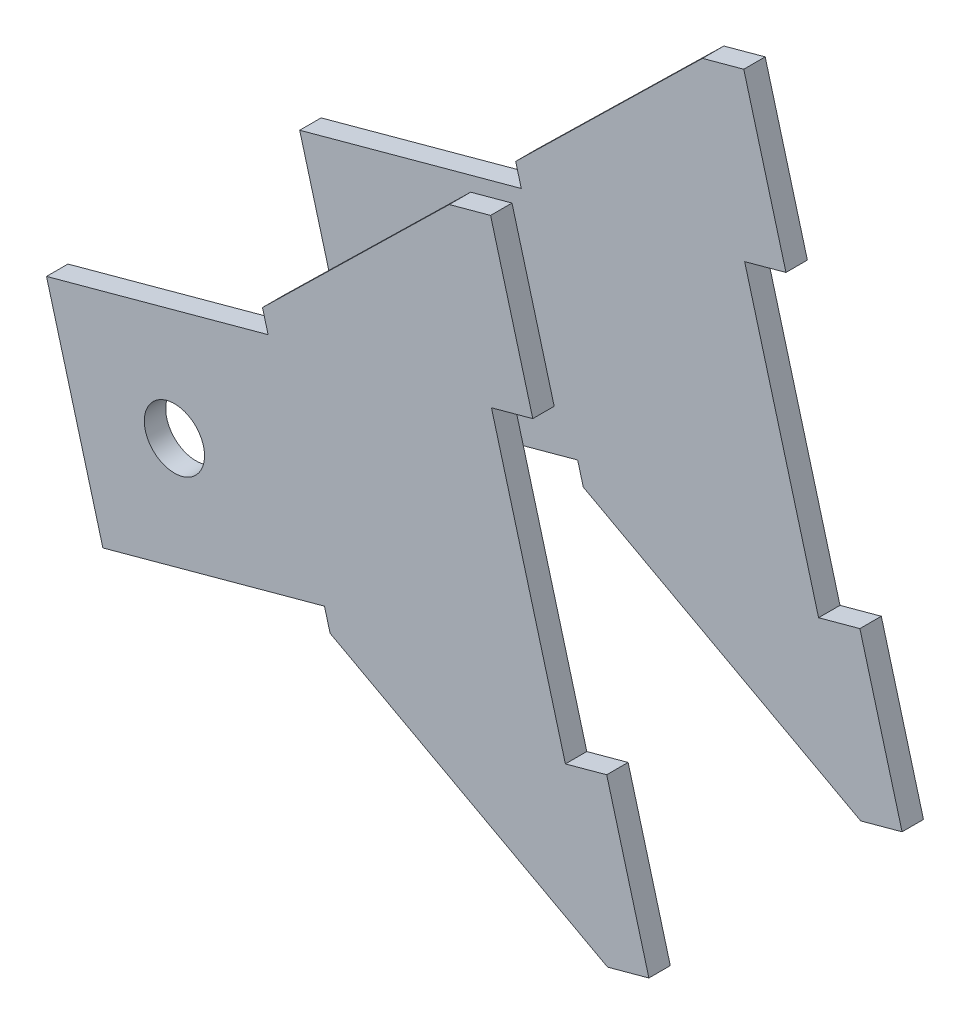
ISO-10303-21;
HEADER;
FILE_DESCRIPTION(('STEP AP214'),'2;1');
FILE_NAME('part.step','',(''),(''),'','','');
FILE_SCHEMA(('AUTOMOTIVE_DESIGN { 1 0 10303 214 1 1 1 1 }'));
ENDSEC;
DATA;
#1=APPLICATION_CONTEXT('core data for automotive mechanical design processes');
#2=APPLICATION_PROTOCOL_DEFINITION('international standard','automotive_design',2000,#1);
#3=PRODUCT_CONTEXT('',#1,'mechanical');
#4=PRODUCT('Part','Part','',(#3));
#5=PRODUCT_RELATED_PRODUCT_CATEGORY('part','',(#4));
#6=PRODUCT_DEFINITION_FORMATION('','',#4);
#7=PRODUCT_DEFINITION_CONTEXT('part definition',#1,'design');
#8=PRODUCT_DEFINITION('design','',#6,#7);
#9=PRODUCT_DEFINITION_SHAPE('','',#8);
#10=(LENGTH_UNIT() NAMED_UNIT(*) SI_UNIT(.MILLI.,.METRE.));
#11=(NAMED_UNIT(*) PLANE_ANGLE_UNIT() SI_UNIT($,.RADIAN.));
#12=(NAMED_UNIT(*) SI_UNIT($,.STERADIAN.) SOLID_ANGLE_UNIT());
#13=UNCERTAINTY_MEASURE_WITH_UNIT(LENGTH_MEASURE(1.E-05),#10,'distance_accuracy_value','');
#14=(GEOMETRIC_REPRESENTATION_CONTEXT(3) GLOBAL_UNCERTAINTY_ASSIGNED_CONTEXT((#13)) GLOBAL_UNIT_ASSIGNED_CONTEXT((#10,
#11,#12)) REPRESENTATION_CONTEXT('',''));
#15=CARTESIAN_POINT('',(0.,0.,0.));
#16=DIRECTION('',(0.,0.,1.));
#17=DIRECTION('',(1.,0.,0.));
#18=AXIS2_PLACEMENT_3D('',#15,#16,#17);
#19=CARTESIAN_POINT('',(0.,0.,-204.004012900365));
#20=DIRECTION('',(0.,0.,-1.));
#21=DIRECTION('',(-1.,0.,0.));
#22=AXIS2_PLACEMENT_3D('',#19,#20,#21);
#23=PLANE('',#22);
#24=DIRECTION('',(-0.96485876454091,-0.262769032590579,0.));
#25=VECTOR('',#24,1.);
#26=CARTESIAN_POINT('',(267.050860355664,223.596103323732,-204.004012900365));
#27=LINE('',#26,#25);
#28=CARTESIAN_POINT('',(286.656790451134,228.935570065972,-204.004012900365));
#29=VERTEX_POINT('',#28);
#30=CARTESIAN_POINT('',(267.050860355664,223.596103323732,-204.004012900365));
#31=VERTEX_POINT('',#30);
#32=EDGE_CURVE('E208',#29,#31,#27,.T.);
#33=ORIENTED_EDGE('',*,*,#32,.T.);
#34=DIRECTION('',(-0.715068372660178,-0.69905452034954,0.));
#35=VECTOR('',#34,1.);
#36=CARTESIAN_POINT('',(178.401012972913,136.931556392834,-204.004012900365));
#37=LINE('',#36,#35);
#38=CARTESIAN_POINT('',(178.401012972913,136.931556392834,-204.004012900365));
#39=VERTEX_POINT('',#38);
#40=EDGE_CURVE('E126',#31,#39,#37,.T.);
#41=ORIENTED_EDGE('',*,*,#40,.T.);
#42=DIRECTION('',(0.26276903259058,-0.96485876454091,0.));
#43=VECTOR('',#42,1.);
#44=CARTESIAN_POINT('',(181.070746344033,127.128591345098,-204.004012900365));
#45=LINE('',#44,#43);
#46=CARTESIAN_POINT('',(181.070746344033,127.128591345098,-204.004012900365));
#47=VERTEX_POINT('',#46);
#48=EDGE_CURVE('E241',#39,#47,#45,.T.);
#49=ORIENTED_EDGE('',*,*,#48,.T.);
#50=DIRECTION('',(-0.964858764540911,-0.262769032590574,0.));
#51=VECTOR('',#50,1.);
#52=CARTESIAN_POINT('',(181.070746344033,127.128591345098,-204.004012900365));
#53=LINE('',#52,#51);
#54=CARTESIAN_POINT('',(75.9011410090733,98.4867667927253,-204.004012900365));
#55=VERTEX_POINT('',#54);
#56=EDGE_CURVE('E260',#47,#55,#53,.T.);
#57=ORIENTED_EDGE('',*,*,#56,.T.);
#58=DIRECTION('',(0.262769032590575,-0.964858764540911,0.));
#59=VECTOR('',#58,1.);
#60=CARTESIAN_POINT('',(75.9011410090733,98.4867667927253,-204.004012900365));
#61=LINE('',#60,#59);
#62=CARTESIAN_POINT('',(102.652911597336,0.257230136134212,-204.004012900365));
#63=VERTEX_POINT('',#62);
#64=EDGE_CURVE('E257',#55,#63,#61,.T.);
#65=ORIENTED_EDGE('',*,*,#64,.T.);
#66=DIRECTION('',(0.964858764540911,0.262769032590574,0.));
#67=VECTOR('',#66,1.);
#68=CARTESIAN_POINT('',(102.652911597336,0.257230136134212,-204.004012900365));
#69=LINE('',#68,#67);
#70=CARTESIAN_POINT('',(207.822516932295,28.8990546885068,-204.004012900365));
#71=VERTEX_POINT('',#70);
#72=EDGE_CURVE('E259',#63,#71,#69,.T.);
#73=ORIENTED_EDGE('',*,*,#72,.T.);
#74=DIRECTION('',(0.262769032590539,-0.964858764540921,0.));
#75=VECTOR('',#74,1.);
#76=CARTESIAN_POINT('',(207.822516932295,28.8990546885068,-204.004012900365));
#77=LINE('',#76,#75);
#78=CARTESIAN_POINT('',(210.492250303415,19.0960896407711,-204.004012900365));
#79=VERTEX_POINT('',#78);
#80=EDGE_CURVE('E262',#71,#79,#77,.T.);
#81=ORIENTED_EDGE('',*,*,#80,.T.);
#82=DIRECTION('',(0.87917784123016,-0.476493781166003,0.));
#83=VECTOR('',#82,1.);
#84=CARTESIAN_POINT('',(210.492250303415,19.0960896407711,-204.004012900365));
#85=LINE('',#84,#83);
#86=CARTESIAN_POINT('',(342.181857254508,-52.2765903946939,-204.004012900365));
#87=VERTEX_POINT('',#86);
#88=EDGE_CURVE('E268',#79,#87,#85,.T.);
#89=ORIENTED_EDGE('',*,*,#88,.T.);
#90=DIRECTION('',(0.96485876454091,0.262769032590578,0.));
#91=VECTOR('',#90,1.);
#92=CARTESIAN_POINT('',(342.181857254508,-52.2765903946939,-204.004012900365));
#93=LINE('',#92,#91);
#94=CARTESIAN_POINT('',(361.78778734998,-46.9371236524534,-204.004012900365));
#95=VERTEX_POINT('',#94);
#96=EDGE_CURVE('E270',#87,#95,#93,.T.);
#97=ORIENTED_EDGE('',*,*,#96,.T.);
#98=DIRECTION('',(-0.262769032590575,0.964858764540911,0.));
#99=VECTOR('',#98,1.);
#100=CARTESIAN_POINT('',(361.78778734998,-46.9371236524534,-204.004012900365));
#101=LINE('',#100,#99);
#102=CARTESIAN_POINT('',(341.764787066578,26.5851142055641,-204.004012900365));
#103=VERTEX_POINT('',#102);
#104=EDGE_CURVE('E272',#95,#103,#101,.T.);
#105=ORIENTED_EDGE('',*,*,#104,.T.);
#106=DIRECTION('',(-0.96485876454091,-0.262769032590578,0.));
#107=VECTOR('',#106,1.);
#108=CARTESIAN_POINT('',(341.764787066578,26.5851142055641,-204.004012900365));
#109=LINE('',#108,#107);
#110=CARTESIAN_POINT('',(322.158856971106,21.2456474633236,-204.004012900365));
#111=VERTEX_POINT('',#110);
#112=EDGE_CURVE('E163',#103,#111,#109,.T.);
#113=ORIENTED_EDGE('',*,*,#112,.T.);
#114=DIRECTION('',(-0.262769032590576,0.964858764540911,0.));
#115=VECTOR('',#114,1.);
#116=CARTESIAN_POINT('',(287.073860639065,150.073865465714,-204.004012900365));
#117=LINE('',#116,#115);
#118=CARTESIAN_POINT('',(287.073860639065,150.073865465714,-204.004012900365));
#119=VERTEX_POINT('',#118);
#120=EDGE_CURVE('E157',#111,#119,#117,.T.);
#121=ORIENTED_EDGE('',*,*,#120,.T.);
#122=DIRECTION('',(0.96485876454091,0.262769032590578,0.));
#123=VECTOR('',#122,1.);
#124=CARTESIAN_POINT('',(306.679790734536,155.413332207955,-204.004012900365));
#125=LINE('',#124,#123);
#126=CARTESIAN_POINT('',(306.679790734536,155.413332207955,-204.004012900365));
#127=VERTEX_POINT('',#126);
#128=EDGE_CURVE('E161',#119,#127,#125,.T.);
#129=ORIENTED_EDGE('',*,*,#128,.T.);
#130=DIRECTION('',(-0.262769032590576,0.964858764540911,0.));
#131=VECTOR('',#130,1.);
#132=CARTESIAN_POINT('',(286.656790451134,228.935570065972,-204.004012900365));
#133=LINE('',#132,#131);
#134=EDGE_CURVE('E65',#127,#29,#133,.T.);
#135=ORIENTED_EDGE('',*,*,#134,.T.);
#136=EDGE_LOOP('',(#33,#41,#49,#57,#65,#73,#81,#89,#97,#105,#113,#121,#129,#135));
#137=FACE_BOUND('',#136,.T.);
#138=CARTESIAN_POINT('',(136.607006946051,62.2618157963527,-204.004012900365));
#139=DIRECTION('',(0.,0.,1.));
#140=DIRECTION('',(1.,0.,0.));
#141=AXIS2_PLACEMENT_3D('',#138,#139,#140);
#142=CIRCLE('',#141,14.2875000004499);
#143=CARTESIAN_POINT('',(150.894506946501,62.2618157963527,-204.004012900365));
#144=VERTEX_POINT('',#143);
#145=EDGE_CURVE('E185',#144,#144,#142,.T.);
#146=ORIENTED_EDGE('',*,*,#145,.F.);
#147=EDGE_LOOP('',(#146));
#148=FACE_BOUND('',#147,.T.);
#149=ADVANCED_FACE('F48',(#137,#148),#23,.F.);
#150=CARTESIAN_POINT('',(0.,0.,-214.164012900365));
#151=DIRECTION('',(0.,0.,-1.));
#152=DIRECTION('',(-1.,0.,0.));
#153=AXIS2_PLACEMENT_3D('',#150,#151,#152);
#154=PLANE('',#153);
#155=DIRECTION('',(-0.96485876454091,-0.262769032590579,0.));
#156=VECTOR('',#155,1.);
#157=CARTESIAN_POINT('',(267.050860355664,223.596103323732,-214.164012900365));
#158=LINE('',#157,#156);
#159=CARTESIAN_POINT('',(286.656790451134,228.935570065972,-214.164012900365));
#160=VERTEX_POINT('',#159);
#161=CARTESIAN_POINT('',(267.050860355664,223.596103323732,-214.164012900365));
#162=VERTEX_POINT('',#161);
#163=EDGE_CURVE('E181',#160,#162,#158,.T.);
#164=ORIENTED_EDGE('',*,*,#163,.F.);
#165=DIRECTION('',(-0.262769032590576,0.964858764540911,0.));
#166=VECTOR('',#165,1.);
#167=CARTESIAN_POINT('',(286.656790451134,228.935570065972,-214.164012900365));
#168=LINE('',#167,#166);
#169=CARTESIAN_POINT('',(306.679790734536,155.413332207955,-214.164012900365));
#170=VERTEX_POINT('',#169);
#171=EDGE_CURVE('E118',#170,#160,#168,.T.);
#172=ORIENTED_EDGE('',*,*,#171,.F.);
#173=DIRECTION('',(0.96485876454091,0.262769032590578,0.));
#174=VECTOR('',#173,1.);
#175=CARTESIAN_POINT('',(306.679790734536,155.413332207955,-214.164012900365));
#176=LINE('',#175,#174);
#177=CARTESIAN_POINT('',(287.073860639065,150.073865465714,-214.164012900365));
#178=VERTEX_POINT('',#177);
#179=EDGE_CURVE('E112',#178,#170,#176,.T.);
#180=ORIENTED_EDGE('',*,*,#179,.F.);
#181=DIRECTION('',(-0.262769032590576,0.964858764540911,0.));
#182=VECTOR('',#181,1.);
#183=CARTESIAN_POINT('',(287.073860639065,150.073865465714,-214.164012900365));
#184=LINE('',#183,#182);
#185=CARTESIAN_POINT('',(322.158856971106,21.2456474633236,-214.164012900365));
#186=VERTEX_POINT('',#185);
#187=EDGE_CURVE('E171',#186,#178,#184,.T.);
#188=ORIENTED_EDGE('',*,*,#187,.F.);
#189=DIRECTION('',(-0.96485876454091,-0.262769032590578,0.));
#190=VECTOR('',#189,1.);
#191=CARTESIAN_POINT('',(341.764787066578,26.5851142055641,-214.164012900365));
#192=LINE('',#191,#190);
#193=CARTESIAN_POINT('',(341.764787066578,26.5851142055641,-214.164012900365));
#194=VERTEX_POINT('',#193);
#195=EDGE_CURVE('E203',#194,#186,#192,.T.);
#196=ORIENTED_EDGE('',*,*,#195,.F.);
#197=DIRECTION('',(-0.262769032590575,0.964858764540911,0.));
#198=VECTOR('',#197,1.);
#199=CARTESIAN_POINT('',(361.78778734998,-46.9371236524534,-214.164012900365));
#200=LINE('',#199,#198);
#201=CARTESIAN_POINT('',(361.78778734998,-46.9371236524534,-214.164012900365));
#202=VERTEX_POINT('',#201);
#203=EDGE_CURVE('E201',#202,#194,#200,.T.);
#204=ORIENTED_EDGE('',*,*,#203,.F.);
#205=DIRECTION('',(0.96485876454091,0.262769032590578,0.));
#206=VECTOR('',#205,1.);
#207=CARTESIAN_POINT('',(342.181857254508,-52.2765903946939,-214.164012900365));
#208=LINE('',#207,#206);
#209=CARTESIAN_POINT('',(342.181857254508,-52.2765903946939,-214.164012900365));
#210=VERTEX_POINT('',#209);
#211=EDGE_CURVE('E199',#210,#202,#208,.T.);
#212=ORIENTED_EDGE('',*,*,#211,.F.);
#213=DIRECTION('',(0.87917784123016,-0.476493781166003,0.));
#214=VECTOR('',#213,1.);
#215=CARTESIAN_POINT('',(210.492250303415,19.0960896407711,-214.164012900365));
#216=LINE('',#215,#214);
#217=CARTESIAN_POINT('',(210.492250303415,19.0960896407711,-214.164012900365));
#218=VERTEX_POINT('',#217);
#219=EDGE_CURVE('E197',#218,#210,#216,.T.);
#220=ORIENTED_EDGE('',*,*,#219,.F.);
#221=DIRECTION('',(0.262769032590539,-0.964858764540921,0.));
#222=VECTOR('',#221,1.);
#223=CARTESIAN_POINT('',(207.822516932295,28.8990546885068,-214.164012900365));
#224=LINE('',#223,#222);
#225=CARTESIAN_POINT('',(207.822516932295,28.8990546885068,-214.164012900365));
#226=VERTEX_POINT('',#225);
#227=EDGE_CURVE('E195',#226,#218,#224,.T.);
#228=ORIENTED_EDGE('',*,*,#227,.F.);
#229=DIRECTION('',(0.964858764540911,0.262769032590574,0.));
#230=VECTOR('',#229,1.);
#231=CARTESIAN_POINT('',(102.652911597336,0.257230136134212,-214.164012900365));
#232=LINE('',#231,#230);
#233=CARTESIAN_POINT('',(102.652911597336,0.257230136134212,-214.164012900365));
#234=VERTEX_POINT('',#233);
#235=EDGE_CURVE('E193',#234,#226,#232,.T.);
#236=ORIENTED_EDGE('',*,*,#235,.F.);
#237=DIRECTION('',(0.262769032590575,-0.964858764540911,0.));
#238=VECTOR('',#237,1.);
#239=CARTESIAN_POINT('',(75.9011410090733,98.4867667927253,-214.164012900365));
#240=LINE('',#239,#238);
#241=CARTESIAN_POINT('',(75.9011410090733,98.4867667927253,-214.164012900365));
#242=VERTEX_POINT('',#241);
#243=EDGE_CURVE('E191',#242,#234,#240,.T.);
#244=ORIENTED_EDGE('',*,*,#243,.F.);
#245=DIRECTION('',(-0.964858764540911,-0.262769032590574,0.));
#246=VECTOR('',#245,1.);
#247=CARTESIAN_POINT('',(181.070746344033,127.128591345098,-214.164012900365));
#248=LINE('',#247,#246);
#249=CARTESIAN_POINT('',(181.070746344033,127.128591345098,-214.164012900365));
#250=VERTEX_POINT('',#249);
#251=EDGE_CURVE('E189',#250,#242,#248,.T.);
#252=ORIENTED_EDGE('',*,*,#251,.F.);
#253=DIRECTION('',(0.26276903259058,-0.96485876454091,0.));
#254=VECTOR('',#253,1.);
#255=CARTESIAN_POINT('',(181.070746344033,127.128591345098,-214.164012900365));
#256=LINE('',#255,#254);
#257=CARTESIAN_POINT('',(178.401012972913,136.931556392834,-214.164012900365));
#258=VERTEX_POINT('',#257);
#259=EDGE_CURVE('E187',#258,#250,#256,.T.);
#260=ORIENTED_EDGE('',*,*,#259,.F.);
#261=DIRECTION('',(-0.715068372660178,-0.69905452034954,0.));
#262=VECTOR('',#261,1.);
#263=CARTESIAN_POINT('',(178.401012972913,136.931556392834,-214.164012900365));
#264=LINE('',#263,#262);
#265=EDGE_CURVE('E184',#162,#258,#264,.T.);
#266=ORIENTED_EDGE('',*,*,#265,.F.);
#267=EDGE_LOOP('',(#164,#172,#180,#188,#196,#204,#212,#220,#228,#236,#244,#252,#260,#266));
#268=FACE_BOUND('',#267,.T.);
#269=CARTESIAN_POINT('',(136.607006946051,62.2618157963527,-214.164012900365));
#270=DIRECTION('',(0.,0.,1.));
#271=DIRECTION('',(1.,0.,0.));
#272=AXIS2_PLACEMENT_3D('',#269,#270,#271);
#273=CIRCLE('',#272,14.2875000004499);
#274=CARTESIAN_POINT('',(150.894506946501,62.2618157963527,-214.164012900365));
#275=VERTEX_POINT('',#274);
#276=EDGE_CURVE('E479',#275,#275,#273,.T.);
#277=ORIENTED_EDGE('',*,*,#276,.T.);
#278=EDGE_LOOP('',(#277));
#279=FACE_BOUND('',#278,.T.);
#280=ADVANCED_FACE('F245',(#268,#279),#154,.T.);
#281=CARTESIAN_POINT('',(267.050860355664,223.596103323732,-204.004012900365));
#282=DIRECTION('',(0.262769032590579,-0.96485876454091,0.));
#283=DIRECTION('',(0.96485876454091,0.262769032590579,0.));
#284=AXIS2_PLACEMENT_3D('',#281,#282,#283);
#285=PLANE('',#284);
#286=ORIENTED_EDGE('',*,*,#163,.T.);
#287=DIRECTION('',(0.,0.,-1.));
#288=VECTOR('',#287,1.);
#289=CARTESIAN_POINT('',(267.050860355664,223.596103323732,-204.004012900365));
#290=LINE('',#289,#288);
#291=EDGE_CURVE('E12',#31,#162,#290,.T.);
#292=ORIENTED_EDGE('',*,*,#291,.F.);
#293=ORIENTED_EDGE('',*,*,#32,.F.);
#294=DIRECTION('',(0.,0.,-1.));
#295=VECTOR('',#294,1.);
#296=CARTESIAN_POINT('',(286.656790451134,228.935570065972,-204.004012900365));
#297=LINE('',#296,#295);
#298=EDGE_CURVE('E177',#29,#160,#297,.T.);
#299=ORIENTED_EDGE('',*,*,#298,.T.);
#300=EDGE_LOOP('',(#286,#292,#293,#299));
#301=FACE_BOUND('',#300,.T.);
#302=ADVANCED_FACE('F50',(#301),#285,.F.);
#303=CARTESIAN_POINT('',(178.401012972913,136.931556392834,-204.004012900365));
#304=DIRECTION('',(0.69905452034954,-0.715068372660178,0.));
#305=DIRECTION('',(0.715068372660178,0.69905452034954,0.));
#306=AXIS2_PLACEMENT_3D('',#303,#304,#305);
#307=PLANE('',#306);
#308=ORIENTED_EDGE('',*,*,#265,.T.);
#309=DIRECTION('',(0.,0.,-1.));
#310=VECTOR('',#309,1.);
#311=CARTESIAN_POINT('',(178.401012972913,136.931556392834,-204.004012900365));
#312=LINE('',#311,#310);
#313=EDGE_CURVE('E57',#39,#258,#312,.T.);
#314=ORIENTED_EDGE('',*,*,#313,.F.);
#315=ORIENTED_EDGE('',*,*,#40,.F.);
#316=ORIENTED_EDGE('',*,*,#291,.T.);
#317=EDGE_LOOP('',(#308,#314,#315,#316));
#318=FACE_BOUND('',#317,.T.);
#319=ADVANCED_FACE('F306',(#318),#307,.F.);
#320=CARTESIAN_POINT('',(181.070746344033,127.128591345098,-204.004012900365));
#321=DIRECTION('',(0.96485876454091,0.26276903259058,0.));
#322=DIRECTION('',(-0.26276903259058,0.96485876454091,0.));
#323=AXIS2_PLACEMENT_3D('',#320,#321,#322);
#324=PLANE('',#323);
#325=ORIENTED_EDGE('',*,*,#259,.T.);
#326=DIRECTION('',(0.,0.,-1.));
#327=VECTOR('',#326,1.);
#328=CARTESIAN_POINT('',(181.070746344033,127.128591345098,-204.004012900365));
#329=LINE('',#328,#327);
#330=EDGE_CURVE('E233',#47,#250,#329,.T.);
#331=ORIENTED_EDGE('',*,*,#330,.F.);
#332=ORIENTED_EDGE('',*,*,#48,.F.);
#333=ORIENTED_EDGE('',*,*,#313,.T.);
#334=EDGE_LOOP('',(#325,#331,#332,#333));
#335=FACE_BOUND('',#334,.T.);
#336=ADVANCED_FACE('F239',(#335),#324,.F.);
#337=CARTESIAN_POINT('',(181.070746344033,127.128591345098,-204.004012900365));
#338=DIRECTION('',(0.262769032590574,-0.964858764540911,0.));
#339=DIRECTION('',(0.964858764540911,0.262769032590574,0.));
#340=AXIS2_PLACEMENT_3D('',#337,#338,#339);
#341=PLANE('',#340);
#342=ORIENTED_EDGE('',*,*,#251,.T.);
#343=DIRECTION('',(0.,0.,-1.));
#344=VECTOR('',#343,1.);
#345=CARTESIAN_POINT('',(75.9011410090733,98.4867667927253,-204.004012900365));
#346=LINE('',#345,#344);
#347=EDGE_CURVE('E230',#55,#242,#346,.T.);
#348=ORIENTED_EDGE('',*,*,#347,.F.);
#349=ORIENTED_EDGE('',*,*,#56,.F.);
#350=ORIENTED_EDGE('',*,*,#330,.T.);
#351=EDGE_LOOP('',(#342,#348,#349,#350));
#352=FACE_BOUND('',#351,.T.);
#353=ADVANCED_FACE('F251',(#352),#341,.F.);
#354=CARTESIAN_POINT('',(75.9011410090733,98.4867667927253,-204.004012900365));
#355=DIRECTION('',(0.964858764540911,0.262769032590575,0.));
#356=DIRECTION('',(-0.262769032590575,0.964858764540911,0.));
#357=AXIS2_PLACEMENT_3D('',#354,#355,#356);
#358=PLANE('',#357);
#359=ORIENTED_EDGE('',*,*,#243,.T.);
#360=DIRECTION('',(0.,0.,-1.));
#361=VECTOR('',#360,1.);
#362=CARTESIAN_POINT('',(102.652911597336,0.257230136134212,-204.004012900365));
#363=LINE('',#362,#361);
#364=EDGE_CURVE('E227',#63,#234,#363,.T.);
#365=ORIENTED_EDGE('',*,*,#364,.F.);
#366=ORIENTED_EDGE('',*,*,#64,.F.);
#367=ORIENTED_EDGE('',*,*,#347,.T.);
#368=EDGE_LOOP('',(#359,#365,#366,#367));
#369=FACE_BOUND('',#368,.T.);
#370=ADVANCED_FACE('F255',(#369),#358,.F.);
#371=CARTESIAN_POINT('',(102.652911597336,0.257230136134212,-204.004012900365));
#372=DIRECTION('',(-0.262769032590574,0.964858764540911,0.));
#373=DIRECTION('',(-0.964858764540911,-0.262769032590574,0.));
#374=AXIS2_PLACEMENT_3D('',#371,#372,#373);
#375=PLANE('',#374);
#376=ORIENTED_EDGE('',*,*,#235,.T.);
#377=DIRECTION('',(0.,0.,-1.));
#378=VECTOR('',#377,1.);
#379=CARTESIAN_POINT('',(207.822516932295,28.8990546885068,-204.004012900365));
#380=LINE('',#379,#378);
#381=EDGE_CURVE('E224',#71,#226,#380,.T.);
#382=ORIENTED_EDGE('',*,*,#381,.F.);
#383=ORIENTED_EDGE('',*,*,#72,.F.);
#384=ORIENTED_EDGE('',*,*,#364,.T.);
#385=EDGE_LOOP('',(#376,#382,#383,#384));
#386=FACE_BOUND('',#385,.T.);
#387=ADVANCED_FACE('F319',(#386),#375,.F.);
#388=CARTESIAN_POINT('',(207.822516932295,28.8990546885068,-204.004012900365));
#389=DIRECTION('',(0.964858764540921,0.262769032590539,0.));
#390=DIRECTION('',(-0.262769032590539,0.964858764540921,0.));
#391=AXIS2_PLACEMENT_3D('',#388,#389,#390);
#392=PLANE('',#391);
#393=ORIENTED_EDGE('',*,*,#227,.T.);
#394=DIRECTION('',(0.,0.,-1.));
#395=VECTOR('',#394,1.);
#396=CARTESIAN_POINT('',(210.492250303415,19.0960896407711,-204.004012900365));
#397=LINE('',#396,#395);
#398=EDGE_CURVE('E221',#79,#218,#397,.T.);
#399=ORIENTED_EDGE('',*,*,#398,.F.);
#400=ORIENTED_EDGE('',*,*,#80,.F.);
#401=ORIENTED_EDGE('',*,*,#381,.T.);
#402=EDGE_LOOP('',(#393,#399,#400,#401));
#403=FACE_BOUND('',#402,.T.);
#404=ADVANCED_FACE('F322',(#403),#392,.F.);
#405=CARTESIAN_POINT('',(210.492250303415,19.0960896407711,-204.004012900365));
#406=DIRECTION('',(0.476493781166003,0.87917784123016,0.));
#407=DIRECTION('',(-0.879177841230161,0.476493781166003,0.));
#408=AXIS2_PLACEMENT_3D('',#405,#406,#407);
#409=PLANE('',#408);
#410=ORIENTED_EDGE('',*,*,#219,.T.);
#411=DIRECTION('',(0.,0.,-1.));
#412=VECTOR('',#411,1.);
#413=CARTESIAN_POINT('',(342.181857254508,-52.2765903946939,-204.004012900365));
#414=LINE('',#413,#412);
#415=EDGE_CURVE('E218',#87,#210,#414,.T.);
#416=ORIENTED_EDGE('',*,*,#415,.F.);
#417=ORIENTED_EDGE('',*,*,#88,.F.);
#418=ORIENTED_EDGE('',*,*,#398,.T.);
#419=EDGE_LOOP('',(#410,#416,#417,#418));
#420=FACE_BOUND('',#419,.T.);
#421=ADVANCED_FACE('F326',(#420),#409,.F.);
#422=CARTESIAN_POINT('',(342.181857254508,-52.2765903946939,-204.004012900365));
#423=DIRECTION('',(-0.262769032590578,0.96485876454091,0.));
#424=DIRECTION('',(-0.96485876454091,-0.262769032590578,0.));
#425=AXIS2_PLACEMENT_3D('',#422,#423,#424);
#426=PLANE('',#425);
#427=ORIENTED_EDGE('',*,*,#211,.T.);
#428=DIRECTION('',(0.,0.,-1.));
#429=VECTOR('',#428,1.);
#430=CARTESIAN_POINT('',(361.78778734998,-46.9371236524534,-204.004012900365));
#431=LINE('',#430,#429);
#432=EDGE_CURVE('E215',#95,#202,#431,.T.);
#433=ORIENTED_EDGE('',*,*,#432,.F.);
#434=ORIENTED_EDGE('',*,*,#96,.F.);
#435=ORIENTED_EDGE('',*,*,#415,.T.);
#436=EDGE_LOOP('',(#427,#433,#434,#435));
#437=FACE_BOUND('',#436,.T.);
#438=ADVANCED_FACE('F330',(#437),#426,.F.);
#439=CARTESIAN_POINT('',(361.78778734998,-46.9371236524534,-204.004012900365));
#440=DIRECTION('',(-0.964858764540911,-0.262769032590575,0.));
#441=DIRECTION('',(0.262769032590576,-0.964858764540911,0.));
#442=AXIS2_PLACEMENT_3D('',#439,#440,#441);
#443=PLANE('',#442);
#444=ORIENTED_EDGE('',*,*,#203,.T.);
#445=DIRECTION('',(0.,0.,-1.));
#446=VECTOR('',#445,1.);
#447=CARTESIAN_POINT('',(341.764787066578,26.5851142055641,-204.004012900365));
#448=LINE('',#447,#446);
#449=EDGE_CURVE('E212',#103,#194,#448,.T.);
#450=ORIENTED_EDGE('',*,*,#449,.F.);
#451=ORIENTED_EDGE('',*,*,#104,.F.);
#452=ORIENTED_EDGE('',*,*,#432,.T.);
#453=EDGE_LOOP('',(#444,#450,#451,#452));
#454=FACE_BOUND('',#453,.T.);
#455=ADVANCED_FACE('F278',(#454),#443,.F.);
#456=CARTESIAN_POINT('',(341.764787066578,26.5851142055641,-204.004012900365));
#457=DIRECTION('',(0.262769032590578,-0.96485876454091,0.));
#458=DIRECTION('',(0.96485876454091,0.262769032590578,0.));
#459=AXIS2_PLACEMENT_3D('',#456,#457,#458);
#460=PLANE('',#459);
#461=ORIENTED_EDGE('',*,*,#195,.T.);
#462=DIRECTION('',(0.,0.,-1.));
#463=VECTOR('',#462,1.);
#464=CARTESIAN_POINT('',(322.158856971106,21.2456474633236,-204.004012900365));
#465=LINE('',#464,#463);
#466=EDGE_CURVE('E172',#111,#186,#465,.T.);
#467=ORIENTED_EDGE('',*,*,#466,.F.);
#468=ORIENTED_EDGE('',*,*,#112,.F.);
#469=ORIENTED_EDGE('',*,*,#449,.T.);
#470=EDGE_LOOP('',(#461,#467,#468,#469));
#471=FACE_BOUND('',#470,.T.);
#472=ADVANCED_FACE('F282',(#471),#460,.F.);
#473=CARTESIAN_POINT('',(287.073860639065,150.073865465714,-204.004012900365));
#474=DIRECTION('',(-0.964858764540911,-0.262769032590576,0.));
#475=DIRECTION('',(0.262769032590576,-0.964858764540911,0.));
#476=AXIS2_PLACEMENT_3D('',#473,#474,#475);
#477=PLANE('',#476);
#478=ORIENTED_EDGE('',*,*,#187,.T.);
#479=DIRECTION('',(0.,0.,-1.));
#480=VECTOR('',#479,1.);
#481=CARTESIAN_POINT('',(287.073860639065,150.073865465714,-204.004012900365));
#482=LINE('',#481,#480);
#483=EDGE_CURVE('E168',#119,#178,#482,.T.);
#484=ORIENTED_EDGE('',*,*,#483,.F.);
#485=ORIENTED_EDGE('',*,*,#120,.F.);
#486=ORIENTED_EDGE('',*,*,#466,.T.);
#487=EDGE_LOOP('',(#478,#484,#485,#486));
#488=FACE_BOUND('',#487,.T.);
#489=ADVANCED_FACE('F169',(#488),#477,.F.);
#490=CARTESIAN_POINT('',(306.679790734536,155.413332207955,-204.004012900365));
#491=DIRECTION('',(-0.262769032590578,0.96485876454091,0.));
#492=DIRECTION('',(-0.96485876454091,-0.262769032590578,0.));
#493=AXIS2_PLACEMENT_3D('',#490,#491,#492);
#494=PLANE('',#493);
#495=ORIENTED_EDGE('',*,*,#179,.T.);
#496=DIRECTION('',(0.,0.,-1.));
#497=VECTOR('',#496,1.);
#498=CARTESIAN_POINT('',(306.679790734536,155.413332207955,-204.004012900365));
#499=LINE('',#498,#497);
#500=EDGE_CURVE('E173',#127,#170,#499,.T.);
#501=ORIENTED_EDGE('',*,*,#500,.F.);
#502=ORIENTED_EDGE('',*,*,#128,.F.);
#503=ORIENTED_EDGE('',*,*,#483,.T.);
#504=EDGE_LOOP('',(#495,#501,#502,#503));
#505=FACE_BOUND('',#504,.T.);
#506=ADVANCED_FACE('F175',(#505),#494,.F.);
#507=CARTESIAN_POINT('',(286.656790451134,228.935570065972,-204.004012900365));
#508=DIRECTION('',(-0.964858764540911,-0.262769032590576,0.));
#509=DIRECTION('',(0.262769032590576,-0.964858764540911,0.));
#510=AXIS2_PLACEMENT_3D('',#507,#508,#509);
#511=PLANE('',#510);
#512=ORIENTED_EDGE('',*,*,#171,.T.);
#513=ORIENTED_EDGE('',*,*,#298,.F.);
#514=ORIENTED_EDGE('',*,*,#134,.F.);
#515=ORIENTED_EDGE('',*,*,#500,.T.);
#516=EDGE_LOOP('',(#512,#513,#514,#515));
#517=FACE_BOUND('',#516,.T.);
#518=ADVANCED_FACE('F286',(#517),#511,.F.);
#519=CARTESIAN_POINT('',(136.607006946051,62.2618157963527,-204.004012900365));
#520=DIRECTION('',(0.,0.,-1.));
#521=DIRECTION('',(-1.,0.,0.));
#522=AXIS2_PLACEMENT_3D('',#519,#520,#521);
#523=CYLINDRICAL_SURFACE('',#522,14.2875000004499);
#524=ORIENTED_EDGE('',*,*,#145,.T.);
#525=EDGE_LOOP('',(#524));
#526=FACE_BOUND('',#525,.T.);
#527=ORIENTED_EDGE('',*,*,#276,.F.);
#528=EDGE_LOOP('',(#527));
#529=FACE_BOUND('',#528,.T.);
#530=ADVANCED_FACE('F288',(#526,#529),#523,.F.);
#531=CLOSED_SHELL('',(#149,#280,#302,#319,#336,#353,#370,#387,#404,#421,#438,#455,#472,#489,
#506,#518,#530));
#532=MANIFOLD_SOLID_BREP('B2',#531);
#533=CARTESIAN_POINT('',(0.,0.,-83.8440129003651));
#534=DIRECTION('',(0.,0.,-1.));
#535=DIRECTION('',(-1.,0.,0.));
#536=AXIS2_PLACEMENT_3D('',#533,#534,#535);
#537=PLANE('',#536);
#538=DIRECTION('',(-0.96485876454091,-0.262769032590579,0.));
#539=VECTOR('',#538,1.);
#540=CARTESIAN_POINT('',(267.050860355664,223.596103323732,-83.8440129003651));
#541=LINE('',#540,#539);
#542=CARTESIAN_POINT('',(286.656790451134,228.935570065972,-83.8440129003651));
#543=VERTEX_POINT('',#542);
#544=CARTESIAN_POINT('',(267.050860355664,223.596103323732,-83.8440129003651));
#545=VERTEX_POINT('',#544);
#546=EDGE_CURVE('E646',#543,#545,#541,.T.);
#547=ORIENTED_EDGE('',*,*,#546,.T.);
#548=DIRECTION('',(-0.715068372660178,-0.69905452034954,0.));
#549=VECTOR('',#548,1.);
#550=CARTESIAN_POINT('',(178.401012972913,136.931556392834,-83.8440129003651));
#551=LINE('',#550,#549);
#552=CARTESIAN_POINT('',(178.401012972913,136.931556392834,-83.8440129003651));
#553=VERTEX_POINT('',#552);
#554=EDGE_CURVE('E564',#545,#553,#551,.T.);
#555=ORIENTED_EDGE('',*,*,#554,.T.);
#556=DIRECTION('',(0.26276903259058,-0.96485876454091,0.));
#557=VECTOR('',#556,1.);
#558=CARTESIAN_POINT('',(181.070746344033,127.128591345098,-83.8440129003651));
#559=LINE('',#558,#557);
#560=CARTESIAN_POINT('',(181.070746344033,127.128591345098,-83.8440129003651));
#561=VERTEX_POINT('',#560);
#562=EDGE_CURVE('E679',#553,#561,#559,.T.);
#563=ORIENTED_EDGE('',*,*,#562,.T.);
#564=DIRECTION('',(-0.964858764540911,-0.262769032590574,0.));
#565=VECTOR('',#564,1.);
#566=CARTESIAN_POINT('',(181.070746344033,127.128591345098,-83.8440129003651));
#567=LINE('',#566,#565);
#568=CARTESIAN_POINT('',(75.9011410090733,98.4867667927253,-83.8440129003651));
#569=VERTEX_POINT('',#568);
#570=EDGE_CURVE('E698',#561,#569,#567,.T.);
#571=ORIENTED_EDGE('',*,*,#570,.T.);
#572=DIRECTION('',(0.262769032590575,-0.964858764540911,0.));
#573=VECTOR('',#572,1.);
#574=CARTESIAN_POINT('',(75.9011410090733,98.4867667927253,-83.8440129003651));
#575=LINE('',#574,#573);
#576=CARTESIAN_POINT('',(102.652911597336,0.257230136134212,-83.8440129003651));
#577=VERTEX_POINT('',#576);
#578=EDGE_CURVE('E695',#569,#577,#575,.T.);
#579=ORIENTED_EDGE('',*,*,#578,.T.);
#580=DIRECTION('',(0.964858764540911,0.262769032590574,0.));
#581=VECTOR('',#580,1.);
#582=CARTESIAN_POINT('',(102.652911597336,0.257230136134212,-83.8440129003651));
#583=LINE('',#582,#581);
#584=CARTESIAN_POINT('',(207.822516932295,28.8990546885068,-83.8440129003651));
#585=VERTEX_POINT('',#584);
#586=EDGE_CURVE('E697',#577,#585,#583,.T.);
#587=ORIENTED_EDGE('',*,*,#586,.T.);
#588=DIRECTION('',(0.262769032590539,-0.964858764540921,0.));
#589=VECTOR('',#588,1.);
#590=CARTESIAN_POINT('',(207.822516932295,28.8990546885068,-83.8440129003651));
#591=LINE('',#590,#589);
#592=CARTESIAN_POINT('',(210.492250303415,19.0960896407711,-83.8440129003651));
#593=VERTEX_POINT('',#592);
#594=EDGE_CURVE('E700',#585,#593,#591,.T.);
#595=ORIENTED_EDGE('',*,*,#594,.T.);
#596=DIRECTION('',(0.87917784123016,-0.476493781166003,0.));
#597=VECTOR('',#596,1.);
#598=CARTESIAN_POINT('',(210.492250303415,19.0960896407711,-83.8440129003651));
#599=LINE('',#598,#597);
#600=CARTESIAN_POINT('',(342.181857254508,-52.2765903946939,-83.8440129003651));
#601=VERTEX_POINT('',#600);
#602=EDGE_CURVE('E706',#593,#601,#599,.T.);
#603=ORIENTED_EDGE('',*,*,#602,.T.);
#604=DIRECTION('',(0.96485876454091,0.262769032590578,0.));
#605=VECTOR('',#604,1.);
#606=CARTESIAN_POINT('',(342.181857254508,-52.2765903946939,-83.8440129003651));
#607=LINE('',#606,#605);
#608=CARTESIAN_POINT('',(361.78778734998,-46.9371236524534,-83.8440129003651));
#609=VERTEX_POINT('',#608);
#610=EDGE_CURVE('E708',#601,#609,#607,.T.);
#611=ORIENTED_EDGE('',*,*,#610,.T.);
#612=DIRECTION('',(-0.262769032590575,0.964858764540911,0.));
#613=VECTOR('',#612,1.);
#614=CARTESIAN_POINT('',(361.78778734998,-46.9371236524534,-83.8440129003651));
#615=LINE('',#614,#613);
#616=CARTESIAN_POINT('',(341.764787066578,26.5851142055641,-83.8440129003651));
#617=VERTEX_POINT('',#616);
#618=EDGE_CURVE('E710',#609,#617,#615,.T.);
#619=ORIENTED_EDGE('',*,*,#618,.T.);
#620=DIRECTION('',(-0.96485876454091,-0.262769032590578,0.));
#621=VECTOR('',#620,1.);
#622=CARTESIAN_POINT('',(341.764787066578,26.5851142055641,-83.8440129003651));
#623=LINE('',#622,#621);
#624=CARTESIAN_POINT('',(322.158856971106,21.2456474633236,-83.8440129003651));
#625=VERTEX_POINT('',#624);
#626=EDGE_CURVE('E601',#617,#625,#623,.T.);
#627=ORIENTED_EDGE('',*,*,#626,.T.);
#628=DIRECTION('',(-0.262769032590576,0.964858764540911,0.));
#629=VECTOR('',#628,1.);
#630=CARTESIAN_POINT('',(287.073860639065,150.073865465714,-83.8440129003651));
#631=LINE('',#630,#629);
#632=CARTESIAN_POINT('',(287.073860639065,150.073865465714,-83.8440129003651));
#633=VERTEX_POINT('',#632);
#634=EDGE_CURVE('E595',#625,#633,#631,.T.);
#635=ORIENTED_EDGE('',*,*,#634,.T.);
#636=DIRECTION('',(0.96485876454091,0.262769032590578,0.));
#637=VECTOR('',#636,1.);
#638=CARTESIAN_POINT('',(306.679790734536,155.413332207955,-83.8440129003651));
#639=LINE('',#638,#637);
#640=CARTESIAN_POINT('',(306.679790734536,155.413332207955,-83.8440129003651));
#641=VERTEX_POINT('',#640);
#642=EDGE_CURVE('E599',#633,#641,#639,.T.);
#643=ORIENTED_EDGE('',*,*,#642,.T.);
#644=DIRECTION('',(-0.262769032590576,0.964858764540911,0.));
#645=VECTOR('',#644,1.);
#646=CARTESIAN_POINT('',(286.656790451134,228.935570065972,-83.8440129003651));
#647=LINE('',#646,#645);
#648=EDGE_CURVE('E503',#641,#543,#647,.T.);
#649=ORIENTED_EDGE('',*,*,#648,.T.);
#650=EDGE_LOOP('',(#547,#555,#563,#571,#579,#587,#595,#603,#611,#619,#627,#635,#643,#649));
#651=FACE_BOUND('',#650,.T.);
#652=CARTESIAN_POINT('',(136.607006946051,62.2618157963527,-83.8440129003651));
#653=DIRECTION('',(0.,0.,1.));
#654=DIRECTION('',(1.,0.,0.));
#655=AXIS2_PLACEMENT_3D('',#652,#653,#654);
#656=CIRCLE('',#655,14.2875000004499);
#657=CARTESIAN_POINT('',(150.894506946501,62.2618157963527,-83.8440129003651));
#658=VERTEX_POINT('',#657);
#659=EDGE_CURVE('E623',#658,#658,#656,.T.);
#660=ORIENTED_EDGE('',*,*,#659,.F.);
#661=EDGE_LOOP('',(#660));
#662=FACE_BOUND('',#661,.T.);
#663=ADVANCED_FACE('F486',(#651,#662),#537,.F.);
#664=CARTESIAN_POINT('',(0.,0.,-94.0040129003651));
#665=DIRECTION('',(0.,0.,-1.));
#666=DIRECTION('',(-1.,0.,0.));
#667=AXIS2_PLACEMENT_3D('',#664,#665,#666);
#668=PLANE('',#667);
#669=DIRECTION('',(-0.96485876454091,-0.262769032590579,0.));
#670=VECTOR('',#669,1.);
#671=CARTESIAN_POINT('',(267.050860355664,223.596103323732,-94.0040129003651));
#672=LINE('',#671,#670);
#673=CARTESIAN_POINT('',(286.656790451134,228.935570065972,-94.0040129003651));
#674=VERTEX_POINT('',#673);
#675=CARTESIAN_POINT('',(267.050860355664,223.596103323732,-94.0040129003651));
#676=VERTEX_POINT('',#675);
#677=EDGE_CURVE('E619',#674,#676,#672,.T.);
#678=ORIENTED_EDGE('',*,*,#677,.F.);
#679=DIRECTION('',(-0.262769032590576,0.964858764540911,0.));
#680=VECTOR('',#679,1.);
#681=CARTESIAN_POINT('',(286.656790451134,228.935570065972,-94.0040129003651));
#682=LINE('',#681,#680);
#683=CARTESIAN_POINT('',(306.679790734536,155.413332207955,-94.0040129003651));
#684=VERTEX_POINT('',#683);
#685=EDGE_CURVE('E556',#684,#674,#682,.T.);
#686=ORIENTED_EDGE('',*,*,#685,.F.);
#687=DIRECTION('',(0.96485876454091,0.262769032590578,0.));
#688=VECTOR('',#687,1.);
#689=CARTESIAN_POINT('',(306.679790734536,155.413332207955,-94.0040129003651));
#690=LINE('',#689,#688);
#691=CARTESIAN_POINT('',(287.073860639065,150.073865465714,-94.0040129003651));
#692=VERTEX_POINT('',#691);
#693=EDGE_CURVE('E550',#692,#684,#690,.T.);
#694=ORIENTED_EDGE('',*,*,#693,.F.);
#695=DIRECTION('',(-0.262769032590576,0.964858764540911,0.));
#696=VECTOR('',#695,1.);
#697=CARTESIAN_POINT('',(287.073860639065,150.073865465714,-94.0040129003651));
#698=LINE('',#697,#696);
#699=CARTESIAN_POINT('',(322.158856971106,21.2456474633236,-94.0040129003651));
#700=VERTEX_POINT('',#699);
#701=EDGE_CURVE('E609',#700,#692,#698,.T.);
#702=ORIENTED_EDGE('',*,*,#701,.F.);
#703=DIRECTION('',(-0.96485876454091,-0.262769032590578,0.));
#704=VECTOR('',#703,1.);
#705=CARTESIAN_POINT('',(341.764787066578,26.5851142055641,-94.0040129003651));
#706=LINE('',#705,#704);
#707=CARTESIAN_POINT('',(341.764787066578,26.5851142055641,-94.0040129003651));
#708=VERTEX_POINT('',#707);
#709=EDGE_CURVE('E641',#708,#700,#706,.T.);
#710=ORIENTED_EDGE('',*,*,#709,.F.);
#711=DIRECTION('',(-0.262769032590575,0.964858764540911,0.));
#712=VECTOR('',#711,1.);
#713=CARTESIAN_POINT('',(361.78778734998,-46.9371236524534,-94.0040129003651));
#714=LINE('',#713,#712);
#715=CARTESIAN_POINT('',(361.78778734998,-46.9371236524534,-94.0040129003651));
#716=VERTEX_POINT('',#715);
#717=EDGE_CURVE('E639',#716,#708,#714,.T.);
#718=ORIENTED_EDGE('',*,*,#717,.F.);
#719=DIRECTION('',(0.96485876454091,0.262769032590578,0.));
#720=VECTOR('',#719,1.);
#721=CARTESIAN_POINT('',(342.181857254508,-52.2765903946939,-94.0040129003651));
#722=LINE('',#721,#720);
#723=CARTESIAN_POINT('',(342.181857254508,-52.2765903946939,-94.0040129003651));
#724=VERTEX_POINT('',#723);
#725=EDGE_CURVE('E637',#724,#716,#722,.T.);
#726=ORIENTED_EDGE('',*,*,#725,.F.);
#727=DIRECTION('',(0.87917784123016,-0.476493781166003,0.));
#728=VECTOR('',#727,1.);
#729=CARTESIAN_POINT('',(210.492250303415,19.0960896407711,-94.0040129003651));
#730=LINE('',#729,#728);
#731=CARTESIAN_POINT('',(210.492250303415,19.0960896407711,-94.0040129003651));
#732=VERTEX_POINT('',#731);
#733=EDGE_CURVE('E635',#732,#724,#730,.T.);
#734=ORIENTED_EDGE('',*,*,#733,.F.);
#735=DIRECTION('',(0.262769032590539,-0.964858764540921,0.));
#736=VECTOR('',#735,1.);
#737=CARTESIAN_POINT('',(207.822516932295,28.8990546885068,-94.0040129003651));
#738=LINE('',#737,#736);
#739=CARTESIAN_POINT('',(207.822516932295,28.8990546885068,-94.0040129003651));
#740=VERTEX_POINT('',#739);
#741=EDGE_CURVE('E633',#740,#732,#738,.T.);
#742=ORIENTED_EDGE('',*,*,#741,.F.);
#743=DIRECTION('',(0.964858764540911,0.262769032590574,0.));
#744=VECTOR('',#743,1.);
#745=CARTESIAN_POINT('',(102.652911597336,0.257230136134212,-94.0040129003651));
#746=LINE('',#745,#744);
#747=CARTESIAN_POINT('',(102.652911597336,0.257230136134212,-94.0040129003651));
#748=VERTEX_POINT('',#747);
#749=EDGE_CURVE('E631',#748,#740,#746,.T.);
#750=ORIENTED_EDGE('',*,*,#749,.F.);
#751=DIRECTION('',(0.262769032590575,-0.964858764540911,0.));
#752=VECTOR('',#751,1.);
#753=CARTESIAN_POINT('',(75.9011410090733,98.4867667927253,-94.0040129003651));
#754=LINE('',#753,#752);
#755=CARTESIAN_POINT('',(75.9011410090733,98.4867667927253,-94.0040129003651));
#756=VERTEX_POINT('',#755);
#757=EDGE_CURVE('E629',#756,#748,#754,.T.);
#758=ORIENTED_EDGE('',*,*,#757,.F.);
#759=DIRECTION('',(-0.964858764540911,-0.262769032590574,0.));
#760=VECTOR('',#759,1.);
#761=CARTESIAN_POINT('',(181.070746344033,127.128591345098,-94.0040129003651));
#762=LINE('',#761,#760);
#763=CARTESIAN_POINT('',(181.070746344033,127.128591345098,-94.0040129003651));
#764=VERTEX_POINT('',#763);
#765=EDGE_CURVE('E627',#764,#756,#762,.T.);
#766=ORIENTED_EDGE('',*,*,#765,.F.);
#767=DIRECTION('',(0.26276903259058,-0.96485876454091,0.));
#768=VECTOR('',#767,1.);
#769=CARTESIAN_POINT('',(181.070746344033,127.128591345098,-94.0040129003651));
#770=LINE('',#769,#768);
#771=CARTESIAN_POINT('',(178.401012972913,136.931556392834,-94.0040129003651));
#772=VERTEX_POINT('',#771);
#773=EDGE_CURVE('E625',#772,#764,#770,.T.);
#774=ORIENTED_EDGE('',*,*,#773,.F.);
#775=DIRECTION('',(-0.715068372660178,-0.69905452034954,0.));
#776=VECTOR('',#775,1.);
#777=CARTESIAN_POINT('',(178.401012972913,136.931556392834,-94.0040129003651));
#778=LINE('',#777,#776);
#779=EDGE_CURVE('E622',#676,#772,#778,.T.);
#780=ORIENTED_EDGE('',*,*,#779,.F.);
#781=EDGE_LOOP('',(#678,#686,#694,#702,#710,#718,#726,#734,#742,#750,#758,#766,#774,#780));
#782=FACE_BOUND('',#781,.T.);
#783=CARTESIAN_POINT('',(136.607006946051,62.2618157963527,-94.0040129003651));
#784=DIRECTION('',(0.,0.,1.));
#785=DIRECTION('',(1.,0.,0.));
#786=AXIS2_PLACEMENT_3D('',#783,#784,#785);
#787=CIRCLE('',#786,14.2875000004499);
#788=CARTESIAN_POINT('',(150.894506946501,62.2618157963527,-94.0040129003651));
#789=VERTEX_POINT('',#788);
#790=EDGE_CURVE('E917',#789,#789,#787,.T.);
#791=ORIENTED_EDGE('',*,*,#790,.T.);
#792=EDGE_LOOP('',(#791));
#793=FACE_BOUND('',#792,.T.);
#794=ADVANCED_FACE('F683',(#782,#793),#668,.T.);
#795=CARTESIAN_POINT('',(267.050860355664,223.596103323732,-83.8440129003651));
#796=DIRECTION('',(0.262769032590579,-0.96485876454091,0.));
#797=DIRECTION('',(0.96485876454091,0.262769032590579,0.));
#798=AXIS2_PLACEMENT_3D('',#795,#796,#797);
#799=PLANE('',#798);
#800=ORIENTED_EDGE('',*,*,#677,.T.);
#801=DIRECTION('',(0.,0.,-1.));
#802=VECTOR('',#801,1.);
#803=CARTESIAN_POINT('',(267.050860355664,223.596103323732,-83.8440129003651));
#804=LINE('',#803,#802);
#805=EDGE_CURVE('E46',#545,#676,#804,.T.);
#806=ORIENTED_EDGE('',*,*,#805,.F.);
#807=ORIENTED_EDGE('',*,*,#546,.F.);
#808=DIRECTION('',(0.,0.,-1.));
#809=VECTOR('',#808,1.);
#810=CARTESIAN_POINT('',(286.656790451134,228.935570065972,-83.8440129003651));
#811=LINE('',#810,#809);
#812=EDGE_CURVE('E615',#543,#674,#811,.T.);
#813=ORIENTED_EDGE('',*,*,#812,.T.);
#814=EDGE_LOOP('',(#800,#806,#807,#813));
#815=FACE_BOUND('',#814,.T.);
#816=ADVANCED_FACE('F488',(#815),#799,.F.);
#817=CARTESIAN_POINT('',(178.401012972913,136.931556392834,-83.8440129003651));
#818=DIRECTION('',(0.69905452034954,-0.715068372660178,0.));
#819=DIRECTION('',(0.715068372660178,0.69905452034954,0.));
#820=AXIS2_PLACEMENT_3D('',#817,#818,#819);
#821=PLANE('',#820);
#822=ORIENTED_EDGE('',*,*,#779,.T.);
#823=DIRECTION('',(0.,0.,-1.));
#824=VECTOR('',#823,1.);
#825=CARTESIAN_POINT('',(178.401012972913,136.931556392834,-83.8440129003651));
#826=LINE('',#825,#824);
#827=EDGE_CURVE('E495',#553,#772,#826,.T.);
#828=ORIENTED_EDGE('',*,*,#827,.F.);
#829=ORIENTED_EDGE('',*,*,#554,.F.);
#830=ORIENTED_EDGE('',*,*,#805,.T.);
#831=EDGE_LOOP('',(#822,#828,#829,#830));
#832=FACE_BOUND('',#831,.T.);
#833=ADVANCED_FACE('F744',(#832),#821,.F.);
#834=CARTESIAN_POINT('',(181.070746344033,127.128591345098,-83.8440129003651));
#835=DIRECTION('',(0.96485876454091,0.26276903259058,0.));
#836=DIRECTION('',(-0.26276903259058,0.96485876454091,0.));
#837=AXIS2_PLACEMENT_3D('',#834,#835,#836);
#838=PLANE('',#837);
#839=ORIENTED_EDGE('',*,*,#773,.T.);
#840=DIRECTION('',(0.,0.,-1.));
#841=VECTOR('',#840,1.);
#842=CARTESIAN_POINT('',(181.070746344033,127.128591345098,-83.8440129003651));
#843=LINE('',#842,#841);
#844=EDGE_CURVE('E671',#561,#764,#843,.T.);
#845=ORIENTED_EDGE('',*,*,#844,.F.);
#846=ORIENTED_EDGE('',*,*,#562,.F.);
#847=ORIENTED_EDGE('',*,*,#827,.T.);
#848=EDGE_LOOP('',(#839,#845,#846,#847));
#849=FACE_BOUND('',#848,.T.);
#850=ADVANCED_FACE('F677',(#849),#838,.F.);
#851=CARTESIAN_POINT('',(181.070746344033,127.128591345098,-83.8440129003651));
#852=DIRECTION('',(0.262769032590574,-0.964858764540911,0.));
#853=DIRECTION('',(0.964858764540911,0.262769032590574,0.));
#854=AXIS2_PLACEMENT_3D('',#851,#852,#853);
#855=PLANE('',#854);
#856=ORIENTED_EDGE('',*,*,#765,.T.);
#857=DIRECTION('',(0.,0.,-1.));
#858=VECTOR('',#857,1.);
#859=CARTESIAN_POINT('',(75.9011410090733,98.4867667927253,-83.8440129003651));
#860=LINE('',#859,#858);
#861=EDGE_CURVE('E668',#569,#756,#860,.T.);
#862=ORIENTED_EDGE('',*,*,#861,.F.);
#863=ORIENTED_EDGE('',*,*,#570,.F.);
#864=ORIENTED_EDGE('',*,*,#844,.T.);
#865=EDGE_LOOP('',(#856,#862,#863,#864));
#866=FACE_BOUND('',#865,.T.);
#867=ADVANCED_FACE('F689',(#866),#855,.F.);
#868=CARTESIAN_POINT('',(75.9011410090733,98.4867667927253,-83.8440129003651));
#869=DIRECTION('',(0.964858764540911,0.262769032590575,0.));
#870=DIRECTION('',(-0.262769032590575,0.964858764540911,0.));
#871=AXIS2_PLACEMENT_3D('',#868,#869,#870);
#872=PLANE('',#871);
#873=ORIENTED_EDGE('',*,*,#757,.T.);
#874=DIRECTION('',(0.,0.,-1.));
#875=VECTOR('',#874,1.);
#876=CARTESIAN_POINT('',(102.652911597336,0.257230136134212,-83.8440129003651));
#877=LINE('',#876,#875);
#878=EDGE_CURVE('E665',#577,#748,#877,.T.);
#879=ORIENTED_EDGE('',*,*,#878,.F.);
#880=ORIENTED_EDGE('',*,*,#578,.F.);
#881=ORIENTED_EDGE('',*,*,#861,.T.);
#882=EDGE_LOOP('',(#873,#879,#880,#881));
#883=FACE_BOUND('',#882,.T.);
#884=ADVANCED_FACE('F693',(#883),#872,.F.);
#885=CARTESIAN_POINT('',(102.652911597336,0.257230136134212,-83.8440129003651));
#886=DIRECTION('',(-0.262769032590574,0.964858764540911,0.));
#887=DIRECTION('',(-0.964858764540911,-0.262769032590574,0.));
#888=AXIS2_PLACEMENT_3D('',#885,#886,#887);
#889=PLANE('',#888);
#890=ORIENTED_EDGE('',*,*,#749,.T.);
#891=DIRECTION('',(0.,0.,-1.));
#892=VECTOR('',#891,1.);
#893=CARTESIAN_POINT('',(207.822516932295,28.8990546885068,-83.8440129003651));
#894=LINE('',#893,#892);
#895=EDGE_CURVE('E662',#585,#740,#894,.T.);
#896=ORIENTED_EDGE('',*,*,#895,.F.);
#897=ORIENTED_EDGE('',*,*,#586,.F.);
#898=ORIENTED_EDGE('',*,*,#878,.T.);
#899=EDGE_LOOP('',(#890,#896,#897,#898));
#900=FACE_BOUND('',#899,.T.);
#901=ADVANCED_FACE('F757',(#900),#889,.F.);
#902=CARTESIAN_POINT('',(207.822516932295,28.8990546885068,-83.8440129003651));
#903=DIRECTION('',(0.964858764540921,0.262769032590539,0.));
#904=DIRECTION('',(-0.262769032590539,0.964858764540921,0.));
#905=AXIS2_PLACEMENT_3D('',#902,#903,#904);
#906=PLANE('',#905);
#907=ORIENTED_EDGE('',*,*,#741,.T.);
#908=DIRECTION('',(0.,0.,-1.));
#909=VECTOR('',#908,1.);
#910=CARTESIAN_POINT('',(210.492250303415,19.0960896407711,-83.8440129003651));
#911=LINE('',#910,#909);
#912=EDGE_CURVE('E659',#593,#732,#911,.T.);
#913=ORIENTED_EDGE('',*,*,#912,.F.);
#914=ORIENTED_EDGE('',*,*,#594,.F.);
#915=ORIENTED_EDGE('',*,*,#895,.T.);
#916=EDGE_LOOP('',(#907,#913,#914,#915));
#917=FACE_BOUND('',#916,.T.);
#918=ADVANCED_FACE('F760',(#917),#906,.F.);
#919=CARTESIAN_POINT('',(210.492250303415,19.0960896407711,-83.8440129003651));
#920=DIRECTION('',(0.476493781166003,0.87917784123016,0.));
#921=DIRECTION('',(-0.879177841230161,0.476493781166003,0.));
#922=AXIS2_PLACEMENT_3D('',#919,#920,#921);
#923=PLANE('',#922);
#924=ORIENTED_EDGE('',*,*,#733,.T.);
#925=DIRECTION('',(0.,0.,-1.));
#926=VECTOR('',#925,1.);
#927=CARTESIAN_POINT('',(342.181857254508,-52.2765903946939,-83.8440129003651));
#928=LINE('',#927,#926);
#929=EDGE_CURVE('E656',#601,#724,#928,.T.);
#930=ORIENTED_EDGE('',*,*,#929,.F.);
#931=ORIENTED_EDGE('',*,*,#602,.F.);
#932=ORIENTED_EDGE('',*,*,#912,.T.);
#933=EDGE_LOOP('',(#924,#930,#931,#932));
#934=FACE_BOUND('',#933,.T.);
#935=ADVANCED_FACE('F764',(#934),#923,.F.);
#936=CARTESIAN_POINT('',(342.181857254508,-52.2765903946939,-83.8440129003651));
#937=DIRECTION('',(-0.262769032590578,0.96485876454091,0.));
#938=DIRECTION('',(-0.96485876454091,-0.262769032590578,0.));
#939=AXIS2_PLACEMENT_3D('',#936,#937,#938);
#940=PLANE('',#939);
#941=ORIENTED_EDGE('',*,*,#725,.T.);
#942=DIRECTION('',(0.,0.,-1.));
#943=VECTOR('',#942,1.);
#944=CARTESIAN_POINT('',(361.78778734998,-46.9371236524534,-83.8440129003651));
#945=LINE('',#944,#943);
#946=EDGE_CURVE('E653',#609,#716,#945,.T.);
#947=ORIENTED_EDGE('',*,*,#946,.F.);
#948=ORIENTED_EDGE('',*,*,#610,.F.);
#949=ORIENTED_EDGE('',*,*,#929,.T.);
#950=EDGE_LOOP('',(#941,#947,#948,#949));
#951=FACE_BOUND('',#950,.T.);
#952=ADVANCED_FACE('F768',(#951),#940,.F.);
#953=CARTESIAN_POINT('',(361.78778734998,-46.9371236524534,-83.8440129003651));
#954=DIRECTION('',(-0.964858764540911,-0.262769032590575,0.));
#955=DIRECTION('',(0.262769032590576,-0.964858764540911,0.));
#956=AXIS2_PLACEMENT_3D('',#953,#954,#955);
#957=PLANE('',#956);
#958=ORIENTED_EDGE('',*,*,#717,.T.);
#959=DIRECTION('',(0.,0.,-1.));
#960=VECTOR('',#959,1.);
#961=CARTESIAN_POINT('',(341.764787066578,26.5851142055641,-83.8440129003651));
#962=LINE('',#961,#960);
#963=EDGE_CURVE('E650',#617,#708,#962,.T.);
#964=ORIENTED_EDGE('',*,*,#963,.F.);
#965=ORIENTED_EDGE('',*,*,#618,.F.);
#966=ORIENTED_EDGE('',*,*,#946,.T.);
#967=EDGE_LOOP('',(#958,#964,#965,#966));
#968=FACE_BOUND('',#967,.T.);
#969=ADVANCED_FACE('F716',(#968),#957,.F.);
#970=CARTESIAN_POINT('',(341.764787066578,26.5851142055641,-83.8440129003651));
#971=DIRECTION('',(0.262769032590578,-0.96485876454091,0.));
#972=DIRECTION('',(0.96485876454091,0.262769032590578,0.));
#973=AXIS2_PLACEMENT_3D('',#970,#971,#972);
#974=PLANE('',#973);
#975=ORIENTED_EDGE('',*,*,#709,.T.);
#976=DIRECTION('',(0.,0.,-1.));
#977=VECTOR('',#976,1.);
#978=CARTESIAN_POINT('',(322.158856971106,21.2456474633236,-83.8440129003651));
#979=LINE('',#978,#977);
#980=EDGE_CURVE('E610',#625,#700,#979,.T.);
#981=ORIENTED_EDGE('',*,*,#980,.F.);
#982=ORIENTED_EDGE('',*,*,#626,.F.);
#983=ORIENTED_EDGE('',*,*,#963,.T.);
#984=EDGE_LOOP('',(#975,#981,#982,#983));
#985=FACE_BOUND('',#984,.T.);
#986=ADVANCED_FACE('F720',(#985),#974,.F.);
#987=CARTESIAN_POINT('',(287.073860639065,150.073865465714,-83.8440129003651));
#988=DIRECTION('',(-0.964858764540911,-0.262769032590576,0.));
#989=DIRECTION('',(0.262769032590576,-0.964858764540911,0.));
#990=AXIS2_PLACEMENT_3D('',#987,#988,#989);
#991=PLANE('',#990);
#992=ORIENTED_EDGE('',*,*,#701,.T.);
#993=DIRECTION('',(0.,0.,-1.));
#994=VECTOR('',#993,1.);
#995=CARTESIAN_POINT('',(287.073860639065,150.073865465714,-83.8440129003651));
#996=LINE('',#995,#994);
#997=EDGE_CURVE('E606',#633,#692,#996,.T.);
#998=ORIENTED_EDGE('',*,*,#997,.F.);
#999=ORIENTED_EDGE('',*,*,#634,.F.);
#1000=ORIENTED_EDGE('',*,*,#980,.T.);
#1001=EDGE_LOOP('',(#992,#998,#999,#1000));
#1002=FACE_BOUND('',#1001,.T.);
#1003=ADVANCED_FACE('F607',(#1002),#991,.F.);
#1004=CARTESIAN_POINT('',(306.679790734536,155.413332207955,-83.8440129003651));
#1005=DIRECTION('',(-0.262769032590578,0.96485876454091,0.));
#1006=DIRECTION('',(-0.96485876454091,-0.262769032590578,0.));
#1007=AXIS2_PLACEMENT_3D('',#1004,#1005,#1006);
#1008=PLANE('',#1007);
#1009=ORIENTED_EDGE('',*,*,#693,.T.);
#1010=DIRECTION('',(0.,0.,-1.));
#1011=VECTOR('',#1010,1.);
#1012=CARTESIAN_POINT('',(306.679790734536,155.413332207955,-83.8440129003651));
#1013=LINE('',#1012,#1011);
#1014=EDGE_CURVE('E611',#641,#684,#1013,.T.);
#1015=ORIENTED_EDGE('',*,*,#1014,.F.);
#1016=ORIENTED_EDGE('',*,*,#642,.F.);
#1017=ORIENTED_EDGE('',*,*,#997,.T.);
#1018=EDGE_LOOP('',(#1009,#1015,#1016,#1017));
#1019=FACE_BOUND('',#1018,.T.);
#1020=ADVANCED_FACE('F613',(#1019),#1008,.F.);
#1021=CARTESIAN_POINT('',(286.656790451134,228.935570065972,-83.8440129003651));
#1022=DIRECTION('',(-0.964858764540911,-0.262769032590576,0.));
#1023=DIRECTION('',(0.262769032590576,-0.964858764540911,0.));
#1024=AXIS2_PLACEMENT_3D('',#1021,#1022,#1023);
#1025=PLANE('',#1024);
#1026=ORIENTED_EDGE('',*,*,#685,.T.);
#1027=ORIENTED_EDGE('',*,*,#812,.F.);
#1028=ORIENTED_EDGE('',*,*,#648,.F.);
#1029=ORIENTED_EDGE('',*,*,#1014,.T.);
#1030=EDGE_LOOP('',(#1026,#1027,#1028,#1029));
#1031=FACE_BOUND('',#1030,.T.);
#1032=ADVANCED_FACE('F724',(#1031),#1025,.F.);
#1033=CARTESIAN_POINT('',(136.607006946051,62.2618157963527,-83.8440129003651));
#1034=DIRECTION('',(0.,0.,-1.));
#1035=DIRECTION('',(-1.,0.,0.));
#1036=AXIS2_PLACEMENT_3D('',#1033,#1034,#1035);
#1037=CYLINDRICAL_SURFACE('',#1036,14.2875000004499);
#1038=ORIENTED_EDGE('',*,*,#659,.T.);
#1039=EDGE_LOOP('',(#1038));
#1040=FACE_BOUND('',#1039,.T.);
#1041=ORIENTED_EDGE('',*,*,#790,.F.);
#1042=EDGE_LOOP('',(#1041));
#1043=FACE_BOUND('',#1042,.T.);
#1044=ADVANCED_FACE('F726',(#1040,#1043),#1037,.F.);
#1045=CLOSED_SHELL('',(#663,#794,#816,#833,#850,#867,#884,#901,#918,#935,#952,#969,#986,#1003,
#1020,#1032,#1044));
#1046=MANIFOLD_SOLID_BREP('B6',#1045);
#1047=ADVANCED_BREP_SHAPE_REPRESENTATION('',(#18,#532,#1046),#14);
#1048=SHAPE_DEFINITION_REPRESENTATION(#9,#1047);
ENDSEC;
END-ISO-10303-21;
